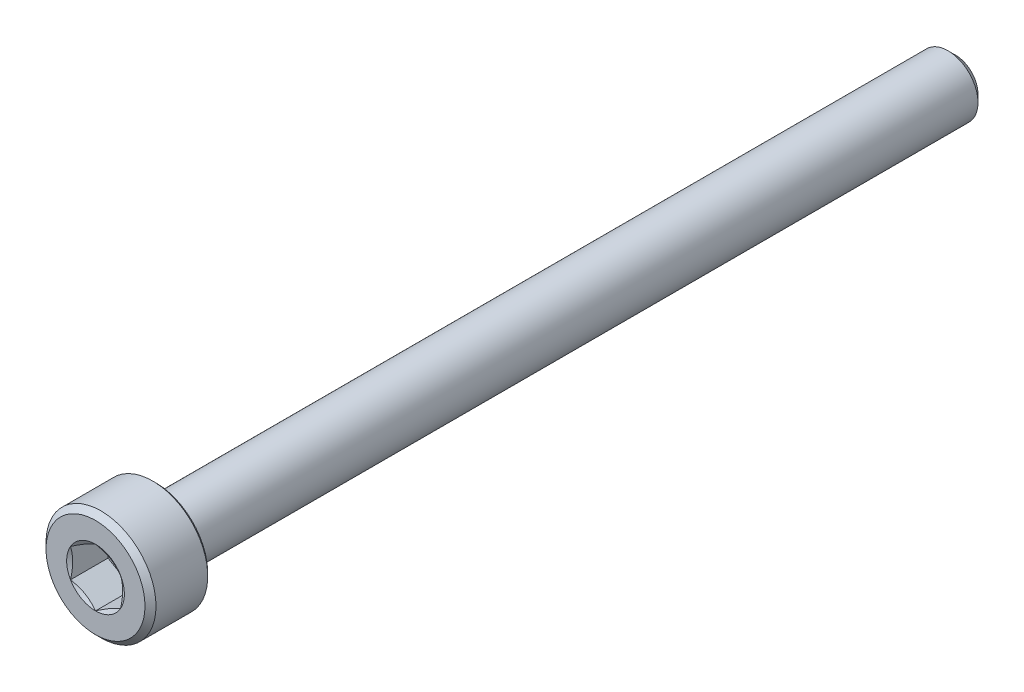
ISO-10303-21;
HEADER;
FILE_DESCRIPTION(('STEP AP214'),'2;1');
FILE_NAME('part.step','',(''),(''),'','','');
FILE_SCHEMA(('AUTOMOTIVE_DESIGN { 1 0 10303 214 1 1 1 1 }'));
ENDSEC;
DATA;
#1=APPLICATION_CONTEXT('core data for automotive mechanical design processes');
#2=APPLICATION_PROTOCOL_DEFINITION('international standard','automotive_design',2000,#1);
#3=PRODUCT_CONTEXT('',#1,'mechanical');
#4=PRODUCT('Part','Part','',(#3));
#5=PRODUCT_RELATED_PRODUCT_CATEGORY('part','',(#4));
#6=PRODUCT_DEFINITION_FORMATION('','',#4);
#7=PRODUCT_DEFINITION_CONTEXT('part definition',#1,'design');
#8=PRODUCT_DEFINITION('design','',#6,#7);
#9=PRODUCT_DEFINITION_SHAPE('','',#8);
#10=(LENGTH_UNIT() NAMED_UNIT(*) SI_UNIT(.MILLI.,.METRE.));
#11=(NAMED_UNIT(*) PLANE_ANGLE_UNIT() SI_UNIT($,.RADIAN.));
#12=(NAMED_UNIT(*) SI_UNIT($,.STERADIAN.) SOLID_ANGLE_UNIT());
#13=UNCERTAINTY_MEASURE_WITH_UNIT(LENGTH_MEASURE(1.E-05),#10,'distance_accuracy_value','');
#14=(GEOMETRIC_REPRESENTATION_CONTEXT(3) GLOBAL_UNCERTAINTY_ASSIGNED_CONTEXT((#13)) GLOBAL_UNIT_ASSIGNED_CONTEXT((#10,
#11,#12)) REPRESENTATION_CONTEXT('',''));
#15=CARTESIAN_POINT('',(0.,0.,0.));
#16=DIRECTION('',(0.,0.,1.));
#17=DIRECTION('',(1.,0.,0.));
#18=AXIS2_PLACEMENT_3D('',#15,#16,#17);
#19=CARTESIAN_POINT('',(-2.6125,0.,18.5));
#20=DIRECTION('',(0.,0.,-1.));
#21=DIRECTION('',(-1.,0.,0.));
#22=AXIS2_PLACEMENT_3D('',#19,#20,#21);
#23=PLANE('',#22);
#24=CARTESIAN_POINT('',(0.,0.,18.5));
#25=DIRECTION('',(0.,0.,-1.));
#26=DIRECTION('',(-1.,0.,0.));
#27=AXIS2_PLACEMENT_3D('',#24,#25,#26);
#28=CIRCLE('',#27,1.5);
#29=CARTESIAN_POINT('',(-1.5,0.,18.5));
#30=VERTEX_POINT('',#29);
#31=EDGE_CURVE('E12',#30,#30,#28,.T.);
#32=ORIENTED_EDGE('',*,*,#31,.F.);
#33=EDGE_LOOP('',(#32));
#34=FACE_BOUND('',#33,.T.);
#35=CARTESIAN_POINT('',(0.,0.,18.5));
#36=DIRECTION('',(0.,0.,-1.));
#37=DIRECTION('',(-1.,0.,0.));
#38=AXIS2_PLACEMENT_3D('',#35,#36,#37);
#39=CIRCLE('',#38,2.6125);
#40=CARTESIAN_POINT('',(-2.6125,0.,18.5));
#41=VERTEX_POINT('',#40);
#42=EDGE_CURVE('E261',#41,#41,#39,.T.);
#43=ORIENTED_EDGE('',*,*,#42,.T.);
#44=EDGE_LOOP('',(#43));
#45=FACE_BOUND('',#44,.T.);
#46=ADVANCED_FACE('F43',(#34,#45),#23,.T.);
#47=CARTESIAN_POINT('',(0.,0.,19.625));
#48=DIRECTION('',(0.,0.,1.));
#49=DIRECTION('',(1.,0.,0.));
#50=AXIS2_PLACEMENT_3D('',#47,#48,#49);
#51=PLANE('',#50);
#52=DIRECTION('',(-0.866025403784439,0.5,0.));
#53=VECTOR('',#52,1.);
#54=CARTESIAN_POINT('',(1.25,0.721687836487031,19.625));
#55=LINE('',#54,#53);
#56=CARTESIAN_POINT('',(1.25,0.721687836487031,19.625));
#57=VERTEX_POINT('',#56);
#58=CARTESIAN_POINT('',(0.,1.44337567297406,19.625));
#59=VERTEX_POINT('',#58);
#60=EDGE_CURVE('E109',#57,#59,#55,.T.);
#61=ORIENTED_EDGE('',*,*,#60,.T.);
#62=DIRECTION('',(-0.866025403784438,-0.5,0.));
#63=VECTOR('',#62,1.);
#64=CARTESIAN_POINT('',(0.,1.44337567297406,19.625));
#65=LINE('',#64,#63);
#66=CARTESIAN_POINT('',(-1.25,0.72168783648703,19.625));
#67=VERTEX_POINT('',#66);
#68=EDGE_CURVE('E228',#59,#67,#65,.T.);
#69=ORIENTED_EDGE('',*,*,#68,.T.);
#70=DIRECTION('',(0.,-1.,0.));
#71=VECTOR('',#70,1.);
#72=CARTESIAN_POINT('',(-1.25,0.72168783648703,19.625));
#73=LINE('',#72,#71);
#74=CARTESIAN_POINT('',(-1.25,-0.721687836487034,19.625));
#75=VERTEX_POINT('',#74);
#76=EDGE_CURVE('E231',#67,#75,#73,.T.);
#77=ORIENTED_EDGE('',*,*,#76,.T.);
#78=DIRECTION('',(0.866025403784439,-0.5,0.));
#79=VECTOR('',#78,1.);
#80=CARTESIAN_POINT('',(-1.25,-0.721687836487034,19.625));
#81=LINE('',#80,#79);
#82=CARTESIAN_POINT('',(0.,-1.44337567297407,19.625));
#83=VERTEX_POINT('',#82);
#84=EDGE_CURVE('E232',#75,#83,#81,.T.);
#85=ORIENTED_EDGE('',*,*,#84,.T.);
#86=DIRECTION('',(0.866025403784439,0.5,0.));
#87=VECTOR('',#86,1.);
#88=CARTESIAN_POINT('',(0.,-1.44337567297407,19.625));
#89=LINE('',#88,#87);
#90=CARTESIAN_POINT('',(1.25,-0.721687836487034,19.625));
#91=VERTEX_POINT('',#90);
#92=EDGE_CURVE('E237',#83,#91,#89,.T.);
#93=ORIENTED_EDGE('',*,*,#92,.T.);
#94=DIRECTION('',(0.,1.,0.));
#95=VECTOR('',#94,1.);
#96=CARTESIAN_POINT('',(1.25,-0.721687836487034,19.625));
#97=LINE('',#96,#95);
#98=EDGE_CURVE('E230',#91,#57,#97,.T.);
#99=ORIENTED_EDGE('',*,*,#98,.T.);
#100=EDGE_LOOP('',(#61,#69,#77,#85,#93,#99));
#101=FACE_BOUND('',#100,.T.);
#102=ADVANCED_FACE('F217',(#101),#51,.T.);
#103=CARTESIAN_POINT('',(0.,1.44337567297406,19.625));
#104=DIRECTION('',(-0.5,0.866025403784438,0.));
#105=DIRECTION('',(-0.866025403784439,-0.5,0.));
#106=AXIS2_PLACEMENT_3D('',#103,#104,#105);
#107=PLANE('',#106);
#108=DIRECTION('',(0.,0.,1.));
#109=VECTOR('',#108,1.);
#110=CARTESIAN_POINT('',(0.,1.44337567297406,19.625));
#111=LINE('',#110,#109);
#112=CARTESIAN_POINT('',(0.,1.44337567297406,21.5));
#113=VERTEX_POINT('',#112);
#114=EDGE_CURVE('E65',#59,#113,#111,.T.);
#115=ORIENTED_EDGE('',*,*,#114,.T.);
#116=CARTESIAN_POINT('',(0.000199999999999545,1.4434911430279,21.500066674666));
#117=CARTESIAN_POINT('',(-0.0547333052317657,1.41177538446486,21.4817459147637));
#118=CARTESIAN_POINT('',(-0.11014078650024,1.37978586023939,21.4650833062006));
#119=CARTESIAN_POINT('',(-0.221915367600341,1.31525277575269,21.4359973039458));
#120=CARTESIAN_POINT('',(-0.278284454841711,1.28270806805991,21.4235842019761));
#121=CARTESIAN_POINT('',(-0.390323974086985,1.21802202146378,21.404259687636));
#122=CARTESIAN_POINT('',(-0.44597715845923,1.1858906404852,21.3972196894474));
#123=CARTESIAN_POINT('',(-0.557545653908392,1.12147653960455,21.3888124326306));
#124=CARTESIAN_POINT('',(-0.613460558937601,1.08919405413422,21.3874382152047));
#125=CARTESIAN_POINT('',(-0.717957921181725,1.02886247391297,21.3902833373679));
#126=CARTESIAN_POINT('',(-0.766555949881316,1.00080438896118,21.39380409882));
#127=CARTESIAN_POINT('',(-0.863435362173238,0.944871034195501,21.4049671126993));
#128=CARTESIAN_POINT('',(-0.911716410192163,0.916995958125018,21.4126131855727));
#129=CARTESIAN_POINT('',(-1.00879588385404,0.860947097873544,21.4317294547005));
#130=CARTESIAN_POINT('',(-1.0575820103519,0.832780414607287,21.4432807569797));
#131=CARTESIAN_POINT('',(-1.1544262522921,0.776867365453646,21.4694983146939));
#132=CARTESIAN_POINT('',(-1.20248561032696,0.749120282155138,21.4841584021391));
#133=CARTESIAN_POINT('',(-1.2502,0.721572366433192,21.500066674666));
#134=B_SPLINE_CURVE_WITH_KNOTS('',3,(#116,#117,#118,#119,#120,#121,#122,#123,#124,#125,#126,
#127,#128,#129,#130,#131,#132,#133),.UNSPECIFIED.,.F.,.F.,(4,2,2,2,2,2,2,2,4),(0.,
0.198150821029559,0.396778196315221,0.5904886173544,0.783961049317182,0.952480056398646,
1.1211553973001,1.2935743034359,1.4656542697693),.UNSPECIFIED.);
#135=CARTESIAN_POINT('',(-1.25,0.721687836487032,21.5));
#136=VERTEX_POINT('',#135);
#137=EDGE_CURVE('E122',#113,#136,#134,.T.);
#138=ORIENTED_EDGE('',*,*,#137,.T.);
#139=DIRECTION('',(0.,0.,1.));
#140=VECTOR('',#139,1.);
#141=CARTESIAN_POINT('',(-1.25,0.72168783648703,19.625));
#142=LINE('',#141,#140);
#143=EDGE_CURVE('E246',#67,#136,#142,.T.);
#144=ORIENTED_EDGE('',*,*,#143,.F.);
#145=ORIENTED_EDGE('',*,*,#68,.F.);
#146=EDGE_LOOP('',(#115,#138,#144,#145));
#147=FACE_BOUND('',#146,.T.);
#148=ADVANCED_FACE('F156',(#147),#107,.F.);
#149=CARTESIAN_POINT('',(-1.25,0.72168783648703,19.625));
#150=DIRECTION('',(-1.,0.,0.));
#151=DIRECTION('',(0.,-1.,0.));
#152=AXIS2_PLACEMENT_3D('',#149,#150,#151);
#153=PLANE('',#152);
#154=ORIENTED_EDGE('',*,*,#143,.T.);
#155=CARTESIAN_POINT('',(-1.25,-1.86893140179217,21.9647941109243));
#156=CARTESIAN_POINT('',(-1.25,-1.81495202267024,21.9388968384665));
#157=CARTESIAN_POINT('',(-1.25,-1.76084125344196,21.9132686219312));
#158=CARTESIAN_POINT('',(-1.25,-1.65228662652066,21.8627027606134));
#159=CARTESIAN_POINT('',(-1.25,-1.59784271100767,21.8377652401103));
#160=CARTESIAN_POINT('',(-1.25,-1.48823931692675,21.7885939163498));
#161=CARTESIAN_POINT('',(-1.25,-1.43307750108907,21.7643652994868));
#162=CARTESIAN_POINT('',(-1.25,-1.3222918844362,21.7169950705039));
#163=CARTESIAN_POINT('',(-1.25,-1.26666810781962,21.6938534018645));
#164=CARTESIAN_POINT('',(-1.25,-1.15340083047607,21.6483546130678));
#165=CARTESIAN_POINT('',(-1.25,-1.09574254265115,21.6260338154653));
#166=CARTESIAN_POINT('',(-1.25,-0.979741082890172,21.583255476912));
#167=CARTESIAN_POINT('',(-1.25,-0.921397826164635,21.5627981694397));
#168=CARTESIAN_POINT('',(-1.25,-0.745435524772238,21.5050842376762));
#169=CARTESIAN_POINT('',(-1.25,-0.626561938132859,21.4713502149769));
#170=CARTESIAN_POINT('',(-1.25,-0.445873083681238,21.4322204068282));
#171=CARTESIAN_POINT('',(-1.25,-0.385304700192767,21.4210940606189));
#172=CARTESIAN_POINT('',(-1.25,-0.26348659206503,21.4034278522676));
#173=CARTESIAN_POINT('',(-1.25,-0.202236913753246,21.3968876801832));
#174=CARTESIAN_POINT('',(-1.25,-0.0801324468775846,21.3889987810428));
#175=CARTESIAN_POINT('',(-1.25,-0.0192817197887163,21.3875887912582));
#176=CARTESIAN_POINT('',(-1.25,0.102319232701152,21.3899161878862));
#177=CARTESIAN_POINT('',(-1.25,0.16306945164586,21.3936538930261));
#178=CARTESIAN_POINT('',(-1.25,0.312961598922924,21.4088980280362));
#179=CARTESIAN_POINT('',(-1.25,0.401813055628259,21.4232612484297));
#180=CARTESIAN_POINT('',(-1.25,0.577788146583198,21.4602998495149));
#181=CARTESIAN_POINT('',(-1.25,0.664909564430748,21.4829852483542));
#182=CARTESIAN_POINT('',(-1.25,0.795209224728791,21.5217374532821));
#183=CARTESIAN_POINT('',(-1.25,0.839061001813533,21.5356229448103));
#184=CARTESIAN_POINT('',(-1.25,0.926308087473952,21.5646784153621));
#185=CARTESIAN_POINT('',(-1.25,0.969703662172459,21.5798475927664));
#186=CARTESIAN_POINT('',(-1.25,1.05609633508794,21.6112501339966));
#187=CARTESIAN_POINT('',(-1.25,1.09909350410933,21.627483304423));
#188=CARTESIAN_POINT('',(-1.25,1.1847490391048,21.6608382439108));
#189=CARTESIAN_POINT('',(-1.25,1.22740734642399,21.6779601631043));
#190=CARTESIAN_POINT('',(-1.25,1.33629459550825,21.7227614292321));
#191=CARTESIAN_POINT('',(-1.25,1.40230581092028,21.7509693835735));
#192=CARTESIAN_POINT('',(-1.25,1.53373213594212,21.8087450811585));
#193=CARTESIAN_POINT('',(-1.25,1.59914720045374,21.8383129262699));
#194=CARTESIAN_POINT('',(-1.25,1.79469680395942,21.9285769200244));
#195=CARTESIAN_POINT('',(-1.25,1.92411390982368,21.9908242731852));
#196=CARTESIAN_POINT('',(-1.25,2.18184246876936,22.1179296229027));
#197=CARTESIAN_POINT('',(-1.25,2.31015236703661,22.182790734765));
#198=CARTESIAN_POINT('',(-1.25,2.56589305685455,22.3141807455315));
#199=CARTESIAN_POINT('',(-1.25,2.69332395754888,22.3807094324427));
#200=CARTESIAN_POINT('',(-1.25,2.93557826301822,22.5085820016458));
#201=CARTESIAN_POINT('',(-1.25,3.05045639113076,22.5698225704122));
#202=CARTESIAN_POINT('',(-1.25,3.27984311898855,22.6930014800409));
#203=CARTESIAN_POINT('',(-1.25,3.39435170485538,22.7549398467262));
#204=CARTESIAN_POINT('',(-1.25,3.62279327872168,22.8791811560561));
#205=CARTESIAN_POINT('',(-1.25,3.73672698995313,22.941482770676));
#206=CARTESIAN_POINT('',(-1.25,3.96436406629495,23.0664914919315));
#207=CARTESIAN_POINT('',(-1.25,4.07806744314788,23.1291985771761));
#208=CARTESIAN_POINT('',(-1.25,4.19168806612954,23.1920543493623));
#209=B_SPLINE_CURVE_WITH_KNOTS('',3,(#155,#156,#157,#158,#159,#160,#161,#162,#163,#164,#165,
#166,#167,#168,#169,#170,#171,#172,#173,#174,#175,#176,#177,#178,#179,#180,#181,#182,#183,#184,
#185,#186,#187,#188,#189,#190,#191,#192,#193,#194,#195,#196,#197,#198,#199,#200,#201,#202,#203,
#204,#205,#206,#207,#208),.UNSPECIFIED.,.F.,.F.,(4,2,2,2,2,2,2,2,2,2,2,2,2,2,2,2,2,2,2,2,2,2,2,
2,2,2,4),(0.,0.179612926712514,0.359257964580624,0.539992735616907,0.720718098311214,
0.906167781883879,1.09164066876278,1.4615401462125,1.64614554413147,1.83073846485712,
2.0131196740194,2.19551217609307,2.46497297688035,2.73475922178117,2.87273702323329,
3.01062928909397,3.14849655975686,3.28638719597089,3.50172172546909,3.7170724117864,
4.14784491349865,4.57914698286382,5.01039449766869,5.40093821140478,5.79149642546539,
6.18106124184771,6.57060567131893),.UNSPECIFIED.);
#210=CARTESIAN_POINT('',(-1.25,-0.721687836487033,21.5));
#211=VERTEX_POINT('',#210);
#212=EDGE_CURVE('E129',#136,#211,#209,.F.);
#213=ORIENTED_EDGE('',*,*,#212,.T.);
#214=DIRECTION('',(0.,0.,1.));
#215=VECTOR('',#214,1.);
#216=CARTESIAN_POINT('',(-1.25,-0.721687836487034,19.625));
#217=LINE('',#216,#215);
#218=EDGE_CURVE('E244',#75,#211,#217,.T.);
#219=ORIENTED_EDGE('',*,*,#218,.F.);
#220=ORIENTED_EDGE('',*,*,#76,.F.);
#221=EDGE_LOOP('',(#154,#213,#219,#220));
#222=FACE_BOUND('',#221,.T.);
#223=ADVANCED_FACE('F151',(#222),#153,.F.);
#224=CARTESIAN_POINT('',(-1.25,-0.721687836487034,19.625));
#225=DIRECTION('',(-0.5,-0.866025403784439,0.));
#226=DIRECTION('',(0.866025403784439,-0.5,0.));
#227=AXIS2_PLACEMENT_3D('',#224,#225,#226);
#228=PLANE('',#227);
#229=ORIENTED_EDGE('',*,*,#218,.T.);
#230=CARTESIAN_POINT('',(-1.2502,-0.721572366433196,21.500066674666));
#231=CARTESIAN_POINT('',(-1.19526669476823,-0.753288124996232,21.4817459147637));
#232=CARTESIAN_POINT('',(-1.13985921349976,-0.785277649221705,21.4650833062006));
#233=CARTESIAN_POINT('',(-1.02808463239966,-0.849810733708405,21.4359973039458));
#234=CARTESIAN_POINT('',(-0.971715545158289,-0.882355441401184,21.4235842019761));
#235=CARTESIAN_POINT('',(-0.859676025913014,-0.94704148799732,21.404259687636));
#236=CARTESIAN_POINT('',(-0.804022841540769,-0.979172868975895,21.3972196894474));
#237=CARTESIAN_POINT('',(-0.692454346091607,-1.04358696985655,21.3888124326306));
#238=CARTESIAN_POINT('',(-0.636539441062399,-1.07586945532688,21.3874382152047));
#239=CARTESIAN_POINT('',(-0.532042078818274,-1.13620103554813,21.3902833373679));
#240=CARTESIAN_POINT('',(-0.483444050118683,-1.16425912049992,21.39380409882));
#241=CARTESIAN_POINT('',(-0.386564637826761,-1.2201924752656,21.4049671126993));
#242=CARTESIAN_POINT('',(-0.338283589807836,-1.24806755133608,21.4126131855727));
#243=CARTESIAN_POINT('',(-0.241204116145956,-1.30411641158755,21.4317294547005));
#244=CARTESIAN_POINT('',(-0.1924179896481,-1.33228309485381,21.4432807569797));
#245=CARTESIAN_POINT('',(-0.0955737477078969,-1.38819614400745,21.4694983146939));
#246=CARTESIAN_POINT('',(-0.0475143896730348,-1.41594322730596,21.4841584021391));
#247=CARTESIAN_POINT('',(0.000200000000000781,-1.4434911430279,21.500066674666));
#248=B_SPLINE_CURVE_WITH_KNOTS('',3,(#230,#231,#232,#233,#234,#235,#236,#237,#238,#239,#240,
#241,#242,#243,#244,#245,#246,#247),.UNSPECIFIED.,.F.,.F.,(4,2,2,2,2,2,2,2,4),(0.,
0.19815082102956,0.396778196315222,0.590488617354401,0.783961049317183,0.952480056398647,
1.1211553973001,1.2935743034359,1.4656542697693),.UNSPECIFIED.);
#249=CARTESIAN_POINT('',(0.,-1.44337567297407,21.5));
#250=VERTEX_POINT('',#249);
#251=EDGE_CURVE('E132',#211,#250,#248,.T.);
#252=ORIENTED_EDGE('',*,*,#251,.T.);
#253=DIRECTION('',(0.,0.,1.));
#254=VECTOR('',#253,1.);
#255=CARTESIAN_POINT('',(0.,-1.44337567297407,19.625));
#256=LINE('',#255,#254);
#257=EDGE_CURVE('E241',#83,#250,#256,.T.);
#258=ORIENTED_EDGE('',*,*,#257,.F.);
#259=ORIENTED_EDGE('',*,*,#84,.F.);
#260=EDGE_LOOP('',(#229,#252,#258,#259));
#261=FACE_BOUND('',#260,.T.);
#262=ADVANCED_FACE('F155',(#261),#228,.F.);
#263=CARTESIAN_POINT('',(0.,-1.44337567297407,19.625));
#264=DIRECTION('',(0.5,-0.866025403784439,0.));
#265=DIRECTION('',(0.866025403784439,0.5,0.));
#266=AXIS2_PLACEMENT_3D('',#263,#264,#265);
#267=PLANE('',#266);
#268=ORIENTED_EDGE('',*,*,#257,.T.);
#269=CARTESIAN_POINT('',(-0.000199999999999969,-1.4434911430279,21.500066674666));
#270=CARTESIAN_POINT('',(0.054733305231765,-1.41177538446487,21.4817459147637));
#271=CARTESIAN_POINT('',(0.11014078650024,-1.3797858602394,21.4650833062006));
#272=CARTESIAN_POINT('',(0.22191536760034,-1.3152527757527,21.4359973039458));
#273=CARTESIAN_POINT('',(0.278284454841711,-1.28270806805992,21.4235842019761));
#274=CARTESIAN_POINT('',(0.390323974086985,-1.21802202146378,21.404259687636));
#275=CARTESIAN_POINT('',(0.445977158459231,-1.1858906404852,21.3972196894474));
#276=CARTESIAN_POINT('',(0.557545653908393,-1.12147653960455,21.3888124326306));
#277=CARTESIAN_POINT('',(0.613460558937601,-1.08919405413422,21.3874382152047));
#278=CARTESIAN_POINT('',(0.717957921181726,-1.02886247391297,21.3902833373679));
#279=CARTESIAN_POINT('',(0.766555949881316,-1.00080438896118,21.39380409882));
#280=CARTESIAN_POINT('',(0.863435362173238,-0.944871034195505,21.4049671126993));
#281=CARTESIAN_POINT('',(0.911716410192163,-0.916995958125022,21.4126131855727));
#282=CARTESIAN_POINT('',(1.00879588385404,-0.860947097873548,21.4317294547005));
#283=CARTESIAN_POINT('',(1.0575820103519,-0.832780414607292,21.4432807569797));
#284=CARTESIAN_POINT('',(1.1544262522921,-0.77686736545365,21.4694983146939));
#285=CARTESIAN_POINT('',(1.20248561032696,-0.749120282155142,21.4841584021391));
#286=CARTESIAN_POINT('',(1.2502,-0.721572366433196,21.500066674666));
#287=B_SPLINE_CURVE_WITH_KNOTS('',3,(#269,#270,#271,#272,#273,#274,#275,#276,#277,#278,#279,
#280,#281,#282,#283,#284,#285,#286),.UNSPECIFIED.,.F.,.F.,(4,2,2,2,2,2,2,2,4),(0.,
0.19815082102956,0.396778196315223,0.590488617354401,0.783961049317183,0.952480056398647,
1.1211553973001,1.2935743034359,1.4656542697693),.UNSPECIFIED.);
#288=CARTESIAN_POINT('',(1.25,-0.721687836487034,21.5));
#289=VERTEX_POINT('',#288);
#290=EDGE_CURVE('E117',#250,#289,#287,.T.);
#291=ORIENTED_EDGE('',*,*,#290,.T.);
#292=DIRECTION('',(0.,0.,1.));
#293=VECTOR('',#292,1.);
#294=CARTESIAN_POINT('',(1.25,-0.721687836487034,19.625));
#295=LINE('',#294,#293);
#296=EDGE_CURVE('E115',#91,#289,#295,.T.);
#297=ORIENTED_EDGE('',*,*,#296,.F.);
#298=ORIENTED_EDGE('',*,*,#92,.F.);
#299=EDGE_LOOP('',(#268,#291,#297,#298));
#300=FACE_BOUND('',#299,.T.);
#301=ADVANCED_FACE('F162',(#300),#267,.F.);
#302=CARTESIAN_POINT('',(1.25,-0.721687836487034,19.625));
#303=DIRECTION('',(1.,0.,0.));
#304=DIRECTION('',(0.,0.,-1.));
#305=AXIS2_PLACEMENT_3D('',#302,#303,#304);
#306=PLANE('',#305);
#307=ORIENTED_EDGE('',*,*,#296,.T.);
#308=CARTESIAN_POINT('',(1.25,-1.86893140179217,21.9647941109243));
#309=CARTESIAN_POINT('',(1.25,-1.81495202267024,21.9388968384665));
#310=CARTESIAN_POINT('',(1.25,-1.76084125344196,21.9132686219312));
#311=CARTESIAN_POINT('',(1.25,-1.65228662652066,21.8627027606134));
#312=CARTESIAN_POINT('',(1.25,-1.59784271100767,21.8377652401103));
#313=CARTESIAN_POINT('',(1.25,-1.48823931692675,21.7885939163498));
#314=CARTESIAN_POINT('',(1.25,-1.43307750108907,21.7643652994868));
#315=CARTESIAN_POINT('',(1.25,-1.3222918844362,21.7169950705039));
#316=CARTESIAN_POINT('',(1.25,-1.26666810781961,21.6938534018645));
#317=CARTESIAN_POINT('',(1.25,-1.15340083047607,21.6483546130678));
#318=CARTESIAN_POINT('',(1.25,-1.09574254265115,21.6260338154653));
#319=CARTESIAN_POINT('',(1.25,-0.979741082890171,21.583255476912));
#320=CARTESIAN_POINT('',(1.25,-0.921397826164634,21.5627981694397));
#321=CARTESIAN_POINT('',(1.25,-0.745435524772236,21.5050842376762));
#322=CARTESIAN_POINT('',(1.25,-0.626561938132858,21.4713502149769));
#323=CARTESIAN_POINT('',(1.25,-0.445873083681238,21.4322204068282));
#324=CARTESIAN_POINT('',(1.25,-0.385304700192767,21.4210940606189));
#325=CARTESIAN_POINT('',(1.25,-0.26348659206503,21.4034278522676));
#326=CARTESIAN_POINT('',(1.25,-0.202236913753246,21.3968876801832));
#327=CARTESIAN_POINT('',(1.25,-0.0801324468775844,21.3889987810428));
#328=CARTESIAN_POINT('',(1.25,-0.0192817197887162,21.3875887912582));
#329=CARTESIAN_POINT('',(1.25,0.102319232701152,21.3899161878862));
#330=CARTESIAN_POINT('',(1.25,0.16306945164586,21.3936538930261));
#331=CARTESIAN_POINT('',(1.25,0.312961598922924,21.4088980280362));
#332=CARTESIAN_POINT('',(1.25,0.401813055628259,21.4232612484297));
#333=CARTESIAN_POINT('',(1.25,0.577788146583197,21.4602998495149));
#334=CARTESIAN_POINT('',(1.25,0.664909564430747,21.4829852483542));
#335=CARTESIAN_POINT('',(1.25,0.795209224728791,21.5217374532821));
#336=CARTESIAN_POINT('',(1.25,0.839061001813534,21.5356229448103));
#337=CARTESIAN_POINT('',(1.25,0.926308087473953,21.5646784153621));
#338=CARTESIAN_POINT('',(1.25,0.96970366217246,21.5798475927664));
#339=CARTESIAN_POINT('',(1.25,1.05609633508794,21.6112501339966));
#340=CARTESIAN_POINT('',(1.25,1.09909350410933,21.627483304423));
#341=CARTESIAN_POINT('',(1.25,1.1847490391048,21.6608382439108));
#342=CARTESIAN_POINT('',(1.25,1.22740734642399,21.6779601631043));
#343=CARTESIAN_POINT('',(1.25,1.33629459550825,21.7227614292321));
#344=CARTESIAN_POINT('',(1.25,1.40230581092028,21.7509693835735));
#345=CARTESIAN_POINT('',(1.25,1.53373213594212,21.8087450811585));
#346=CARTESIAN_POINT('',(1.25,1.59914720045374,21.8383129262699));
#347=CARTESIAN_POINT('',(1.25,1.79469680395943,21.9285769200244));
#348=CARTESIAN_POINT('',(1.25,1.92411390982368,21.9908242731852));
#349=CARTESIAN_POINT('',(1.25,2.18184246876936,22.1179296229027));
#350=CARTESIAN_POINT('',(1.25,2.31015236703662,22.1827907347651));
#351=CARTESIAN_POINT('',(1.25,2.56589305685455,22.3141807455315));
#352=CARTESIAN_POINT('',(1.25,2.69332395754888,22.3807094324427));
#353=CARTESIAN_POINT('',(1.25,2.93557826301822,22.5085820016458));
#354=CARTESIAN_POINT('',(1.25,3.05045639113076,22.5698225704122));
#355=CARTESIAN_POINT('',(1.25,3.27984311898855,22.6930014800409));
#356=CARTESIAN_POINT('',(1.25,3.39435170485539,22.7549398467262));
#357=CARTESIAN_POINT('',(1.25,3.62279327872168,22.8791811560561));
#358=CARTESIAN_POINT('',(1.25,3.73672698995314,22.941482770676));
#359=CARTESIAN_POINT('',(1.25,3.96436406629495,23.0664914919315));
#360=CARTESIAN_POINT('',(1.25,4.07806744314788,23.1291985771761));
#361=CARTESIAN_POINT('',(1.25,4.19168806612954,23.1920543493623));
#362=B_SPLINE_CURVE_WITH_KNOTS('',3,(#308,#309,#310,#311,#312,#313,#314,#315,#316,#317,#318,
#319,#320,#321,#322,#323,#324,#325,#326,#327,#328,#329,#330,#331,#332,#333,#334,#335,#336,#337,
#338,#339,#340,#341,#342,#343,#344,#345,#346,#347,#348,#349,#350,#351,#352,#353,#354,#355,#356,
#357,#358,#359,#360,#361),.UNSPECIFIED.,.F.,.F.,(4,2,2,2,2,2,2,2,2,2,2,2,2,2,2,2,2,2,2,2,2,2,2,
2,2,2,4),(0.,0.179612926712514,0.359257964580624,0.539992735616909,0.720718098311214,
0.906167781883879,1.09164066876279,1.4615401462125,1.64614554413147,1.83073846485712,
2.0131196740194,2.19551217609307,2.46497297688034,2.73475922178117,2.87273702323329,
3.01062928909397,3.14849655975686,3.28638719597089,3.50172172546909,3.7170724117864,
4.14784491349865,4.57914698286382,5.0103944976687,5.40093821140478,5.79149642546539,
6.18106124184772,6.57060567131893),.UNSPECIFIED.);
#363=CARTESIAN_POINT('',(1.25,0.721687836487028,21.5));
#364=VERTEX_POINT('',#363);
#365=EDGE_CURVE('E101',#289,#364,#362,.T.);
#366=ORIENTED_EDGE('',*,*,#365,.T.);
#367=DIRECTION('',(0.,0.,1.));
#368=VECTOR('',#367,1.);
#369=CARTESIAN_POINT('',(1.25,0.721687836487031,19.625));
#370=LINE('',#369,#368);
#371=EDGE_CURVE('E114',#57,#364,#370,.T.);
#372=ORIENTED_EDGE('',*,*,#371,.F.);
#373=ORIENTED_EDGE('',*,*,#98,.F.);
#374=EDGE_LOOP('',(#307,#366,#372,#373));
#375=FACE_BOUND('',#374,.T.);
#376=ADVANCED_FACE('F112',(#375),#306,.F.);
#377=CARTESIAN_POINT('',(1.25,0.721687836487031,19.625));
#378=DIRECTION('',(0.5,0.866025403784439,0.));
#379=DIRECTION('',(-0.866025403784439,0.5,0.));
#380=AXIS2_PLACEMENT_3D('',#377,#378,#379);
#381=PLANE('',#380);
#382=ORIENTED_EDGE('',*,*,#371,.T.);
#383=CARTESIAN_POINT('',(1.2502,0.721572366433193,21.500066674666));
#384=CARTESIAN_POINT('',(1.19526669476823,0.753288124996229,21.4817459147637));
#385=CARTESIAN_POINT('',(1.13985921349976,0.785277649221701,21.4650833062006));
#386=CARTESIAN_POINT('',(1.02808463239966,0.849810733708402,21.4359973039458));
#387=CARTESIAN_POINT('',(0.971715545158289,0.882355441401181,21.4235842019761));
#388=CARTESIAN_POINT('',(0.859676025913015,0.947041487997316,21.404259687636));
#389=CARTESIAN_POINT('',(0.80402284154077,0.979172868975892,21.3972196894474));
#390=CARTESIAN_POINT('',(0.692454346091608,1.04358696985655,21.3888124326306));
#391=CARTESIAN_POINT('',(0.636539441062399,1.07586945532687,21.3874382152047));
#392=CARTESIAN_POINT('',(0.532042078818275,1.13620103554812,21.3902833373679));
#393=CARTESIAN_POINT('',(0.483444050118684,1.16425912049992,21.39380409882));
#394=CARTESIAN_POINT('',(0.386564637826761,1.22019247526559,21.4049671126993));
#395=CARTESIAN_POINT('',(0.338283589807836,1.24806755133608,21.4126131855727));
#396=CARTESIAN_POINT('',(0.241204116145956,1.30411641158755,21.4317294547005));
#397=CARTESIAN_POINT('',(0.1924179896481,1.33228309485381,21.4432807569797));
#398=CARTESIAN_POINT('',(0.0955737477078974,1.38819614400745,21.4694983146939));
#399=CARTESIAN_POINT('',(0.0475143896730353,1.41594322730595,21.4841584021391));
#400=CARTESIAN_POINT('',(-0.00020000000000046,1.4434911430279,21.500066674666));
#401=B_SPLINE_CURVE_WITH_KNOTS('',3,(#383,#384,#385,#386,#387,#388,#389,#390,#391,#392,#393,
#394,#395,#396,#397,#398,#399,#400),.UNSPECIFIED.,.F.,.F.,(4,2,2,2,2,2,2,2,4),(0.,
0.19815082102956,0.396778196315221,0.5904886173544,0.783961049317182,0.952480056398646,
1.1211553973001,1.2935743034359,1.4656542697693),.UNSPECIFIED.);
#402=EDGE_CURVE('E106',#364,#113,#401,.T.);
#403=ORIENTED_EDGE('',*,*,#402,.T.);
#404=ORIENTED_EDGE('',*,*,#114,.F.);
#405=ORIENTED_EDGE('',*,*,#60,.F.);
#406=EDGE_LOOP('',(#382,#403,#404,#405));
#407=FACE_BOUND('',#406,.T.);
#408=ADVANCED_FACE('F119',(#407),#381,.F.);
#409=CARTESIAN_POINT('',(0.,0.,21.5));
#410=DIRECTION('',(0.,0.,1.));
#411=DIRECTION('',(1.,0.,0.));
#412=AXIS2_PLACEMENT_3D('',#409,#410,#411);
#413=CONICAL_SURFACE('',#412,1.44337567297406,1.0471975511966);
#414=CARTESIAN_POINT('',(0.,0.,21.5));
#415=DIRECTION('',(0.,0.,1.));
#416=DIRECTION('',(1.,0.,0.));
#417=AXIS2_PLACEMENT_3D('',#414,#415,#416);
#418=CIRCLE('',#417,1.44337567297406);
#419=EDGE_CURVE('E128',#113,#136,#418,.T.);
#420=ORIENTED_EDGE('',*,*,#419,.T.);
#421=ORIENTED_EDGE('',*,*,#137,.F.);
#422=EDGE_LOOP('',(#420,#421));
#423=FACE_BOUND('',#422,.T.);
#424=ADVANCED_FACE('F186',(#423),#413,.F.);
#425=EDGE_CURVE('E130',#136,#211,#418,.T.);
#426=ORIENTED_EDGE('',*,*,#425,.T.);
#427=ORIENTED_EDGE('',*,*,#212,.F.);
#428=EDGE_LOOP('',(#426,#427));
#429=FACE_BOUND('',#428,.T.);
#430=ADVANCED_FACE('F297',(#429),#413,.F.);
#431=EDGE_CURVE('E286',#211,#250,#418,.T.);
#432=ORIENTED_EDGE('',*,*,#431,.T.);
#433=ORIENTED_EDGE('',*,*,#251,.F.);
#434=EDGE_LOOP('',(#432,#433));
#435=FACE_BOUND('',#434,.T.);
#436=ADVANCED_FACE('F295',(#435),#413,.F.);
#437=EDGE_CURVE('E105',#250,#289,#418,.T.);
#438=ORIENTED_EDGE('',*,*,#437,.T.);
#439=ORIENTED_EDGE('',*,*,#290,.F.);
#440=EDGE_LOOP('',(#438,#439));
#441=FACE_BOUND('',#440,.T.);
#442=ADVANCED_FACE('F292',(#441),#413,.F.);
#443=EDGE_CURVE('E51',#289,#364,#418,.T.);
#444=ORIENTED_EDGE('',*,*,#443,.T.);
#445=ORIENTED_EDGE('',*,*,#365,.F.);
#446=EDGE_LOOP('',(#444,#445));
#447=FACE_BOUND('',#446,.T.);
#448=ADVANCED_FACE('F99',(#447),#413,.F.);
#449=EDGE_CURVE('E46',#364,#113,#418,.T.);
#450=ORIENTED_EDGE('',*,*,#449,.T.);
#451=ORIENTED_EDGE('',*,*,#402,.F.);
#452=EDGE_LOOP('',(#450,#451));
#453=FACE_BOUND('',#452,.T.);
#454=ADVANCED_FACE('F107',(#453),#413,.F.);
#455=CARTESIAN_POINT('',(0.,2.74999999999999,21.5));
#456=DIRECTION('',(0.,0.,1.));
#457=DIRECTION('',(1.,0.,0.));
#458=AXIS2_PLACEMENT_3D('',#455,#456,#457);
#459=PLANE('',#458);
#460=CARTESIAN_POINT('',(0.,0.,21.5));
#461=DIRECTION('',(0.,0.,1.));
#462=DIRECTION('',(1.,0.,0.));
#463=AXIS2_PLACEMENT_3D('',#460,#461,#462);
#464=CIRCLE('',#463,2.47499999999999);
#465=CARTESIAN_POINT('',(2.47499999999999,0.,21.5));
#466=VERTEX_POINT('',#465);
#467=EDGE_CURVE('E258',#466,#466,#464,.T.);
#468=ORIENTED_EDGE('',*,*,#467,.T.);
#469=EDGE_LOOP('',(#468));
#470=FACE_BOUND('',#469,.T.);
#471=ORIENTED_EDGE('',*,*,#449,.F.);
#472=ORIENTED_EDGE('',*,*,#443,.F.);
#473=ORIENTED_EDGE('',*,*,#437,.F.);
#474=ORIENTED_EDGE('',*,*,#431,.F.);
#475=ORIENTED_EDGE('',*,*,#425,.F.);
#476=ORIENTED_EDGE('',*,*,#419,.F.);
#477=EDGE_LOOP('',(#471,#472,#473,#474,#475,#476));
#478=FACE_BOUND('',#477,.T.);
#479=ADVANCED_FACE('F125',(#470,#478),#459,.T.);
#480=CARTESIAN_POINT('',(0.,0.,21.225));
#481=DIRECTION('',(0.,0.,-1.));
#482=DIRECTION('',(-1.,0.,0.));
#483=AXIS2_PLACEMENT_3D('',#480,#481,#482);
#484=CONICAL_SURFACE('',#483,2.75,0.785398163397439);
#485=ORIENTED_EDGE('',*,*,#467,.F.);
#486=EDGE_LOOP('',(#485));
#487=FACE_BOUND('',#486,.T.);
#488=CARTESIAN_POINT('',(0.,0.,21.225));
#489=DIRECTION('',(0.,0.,1.));
#490=DIRECTION('',(1.,0.,0.));
#491=AXIS2_PLACEMENT_3D('',#488,#489,#490);
#492=CIRCLE('',#491,2.75);
#493=CARTESIAN_POINT('',(2.75,0.,21.225));
#494=VERTEX_POINT('',#493);
#495=EDGE_CURVE('E255',#494,#494,#492,.F.);
#496=ORIENTED_EDGE('',*,*,#495,.F.);
#497=EDGE_LOOP('',(#496));
#498=FACE_BOUND('',#497,.T.);
#499=ADVANCED_FACE('F191',(#487,#498),#484,.T.);
#500=CARTESIAN_POINT('',(0.,0.,-21.5));
#501=DIRECTION('',(0.,0.,-1.));
#502=DIRECTION('',(-1.,0.,0.));
#503=AXIS2_PLACEMENT_3D('',#500,#501,#502);
#504=CYLINDRICAL_SURFACE('',#503,2.75);
#505=CARTESIAN_POINT('',(0.,0.,18.6375));
#506=DIRECTION('',(0.,0.,-1.));
#507=DIRECTION('',(-1.,0.,0.));
#508=AXIS2_PLACEMENT_3D('',#505,#506,#507);
#509=CIRCLE('',#508,2.75);
#510=CARTESIAN_POINT('',(-2.75,0.,18.6375));
#511=VERTEX_POINT('',#510);
#512=EDGE_CURVE('E264',#511,#511,#509,.F.);
#513=ORIENTED_EDGE('',*,*,#512,.T.);
#514=EDGE_LOOP('',(#513));
#515=FACE_BOUND('',#514,.T.);
#516=ORIENTED_EDGE('',*,*,#495,.T.);
#517=EDGE_LOOP('',(#516));
#518=FACE_BOUND('',#517,.T.);
#519=ADVANCED_FACE('F187',(#515,#518),#504,.T.);
#520=CARTESIAN_POINT('',(0.,0.,18.5));
#521=DIRECTION('',(0.,0.,1.));
#522=DIRECTION('',(1.,0.,0.));
#523=AXIS2_PLACEMENT_3D('',#520,#521,#522);
#524=CONICAL_SURFACE('',#523,2.6125,0.785398163397467);
#525=ORIENTED_EDGE('',*,*,#512,.F.);
#526=EDGE_LOOP('',(#525));
#527=FACE_BOUND('',#526,.T.);
#528=ORIENTED_EDGE('',*,*,#42,.F.);
#529=EDGE_LOOP('',(#528));
#530=FACE_BOUND('',#529,.T.);
#531=ADVANCED_FACE('F190',(#527,#530),#524,.T.);
#532=CARTESIAN_POINT('',(0.,0.,-21.5));
#533=DIRECTION('',(0.,0.,-1.));
#534=DIRECTION('',(-1.,0.,0.));
#535=AXIS2_PLACEMENT_3D('',#532,#533,#534);
#536=CYLINDRICAL_SURFACE('',#535,1.5);
#537=CARTESIAN_POINT('',(0.,0.,-21.125));
#538=DIRECTION('',(0.,0.,-1.));
#539=DIRECTION('',(-1.,0.,0.));
#540=AXIS2_PLACEMENT_3D('',#537,#538,#539);
#541=CIRCLE('',#540,1.5);
#542=CARTESIAN_POINT('',(-1.5,0.,-21.125));
#543=VERTEX_POINT('',#542);
#544=EDGE_CURVE('E270',#543,#543,#541,.T.);
#545=ORIENTED_EDGE('',*,*,#544,.F.);
#546=EDGE_LOOP('',(#545));
#547=FACE_BOUND('',#546,.T.);
#548=ORIENTED_EDGE('',*,*,#31,.T.);
#549=EDGE_LOOP('',(#548));
#550=FACE_BOUND('',#549,.T.);
#551=ADVANCED_FACE('F201',(#547,#550),#536,.T.);
#552=CARTESIAN_POINT('',(0.,0.,-21.125));
#553=DIRECTION('',(0.,0.,1.));
#554=DIRECTION('',(1.,0.,0.));
#555=AXIS2_PLACEMENT_3D('',#552,#553,#554);
#556=CONICAL_SURFACE('',#555,1.5,0.785398163397448);
#557=CARTESIAN_POINT('',(0.,0.,-21.5));
#558=DIRECTION('',(0.,0.,-1.));
#559=DIRECTION('',(-1.,0.,0.));
#560=AXIS2_PLACEMENT_3D('',#557,#558,#559);
#561=CIRCLE('',#560,1.125);
#562=CARTESIAN_POINT('',(-1.125,0.,-21.5));
#563=VERTEX_POINT('',#562);
#564=EDGE_CURVE('E266',#563,#563,#561,.T.);
#565=ORIENTED_EDGE('',*,*,#564,.F.);
#566=EDGE_LOOP('',(#565));
#567=FACE_BOUND('',#566,.T.);
#568=ORIENTED_EDGE('',*,*,#544,.T.);
#569=EDGE_LOOP('',(#568));
#570=FACE_BOUND('',#569,.T.);
#571=ADVANCED_FACE('F205',(#567,#570),#556,.T.);
#572=CARTESIAN_POINT('',(0.,1.49999999999999,-21.5));
#573=DIRECTION('',(0.,0.,-1.));
#574=DIRECTION('',(-1.,0.,0.));
#575=AXIS2_PLACEMENT_3D('',#572,#573,#574);
#576=PLANE('',#575);
#577=ORIENTED_EDGE('',*,*,#564,.T.);
#578=EDGE_LOOP('',(#577));
#579=FACE_BOUND('',#578,.T.);
#580=ADVANCED_FACE('F207',(#579),#576,.T.);
#581=CLOSED_SHELL('',(#46,#102,#148,#223,#262,#301,#376,#408,#424,#430,#436,#442,#448,#454,#479,
#499,#519,#531,#551,#571,#580));
#582=MANIFOLD_SOLID_BREP('B2',#581);
#583=ADVANCED_BREP_SHAPE_REPRESENTATION('',(#18,#582),#14);
#584=SHAPE_DEFINITION_REPRESENTATION(#9,#583);
ENDSEC;
END-ISO-10303-21;
